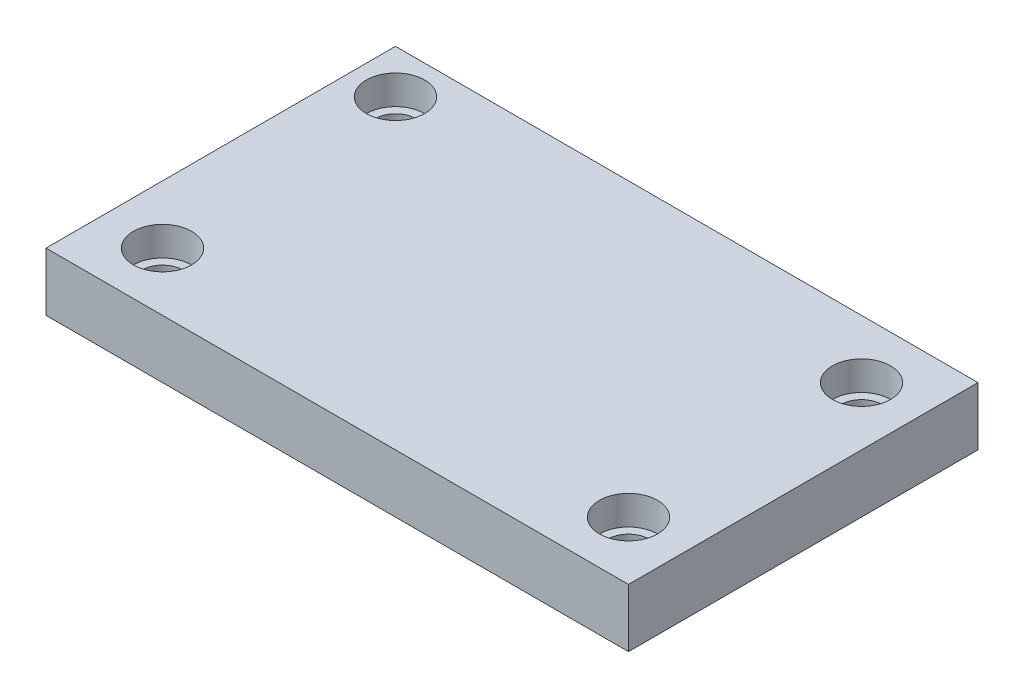
ISO-10303-21;
HEADER;
FILE_DESCRIPTION(('STEP AP214'),'2;1');
FILE_NAME('part.step','',(''),(''),'','','');
FILE_SCHEMA(('AUTOMOTIVE_DESIGN { 1 0 10303 214 1 1 1 1 }'));
ENDSEC;
DATA;
#1=APPLICATION_CONTEXT('core data for automotive mechanical design processes');
#2=APPLICATION_PROTOCOL_DEFINITION('international standard','automotive_design',2000,#1);
#3=PRODUCT_CONTEXT('',#1,'mechanical');
#4=PRODUCT('Part','Part','',(#3));
#5=PRODUCT_RELATED_PRODUCT_CATEGORY('part','',(#4));
#6=PRODUCT_DEFINITION_FORMATION('','',#4);
#7=PRODUCT_DEFINITION_CONTEXT('part definition',#1,'design');
#8=PRODUCT_DEFINITION('design','',#6,#7);
#9=PRODUCT_DEFINITION_SHAPE('','',#8);
#10=(LENGTH_UNIT() NAMED_UNIT(*) SI_UNIT(.MILLI.,.METRE.));
#11=(NAMED_UNIT(*) PLANE_ANGLE_UNIT() SI_UNIT($,.RADIAN.));
#12=(NAMED_UNIT(*) SI_UNIT($,.STERADIAN.) SOLID_ANGLE_UNIT());
#13=UNCERTAINTY_MEASURE_WITH_UNIT(LENGTH_MEASURE(1.E-05),#10,'distance_accuracy_value','');
#14=(GEOMETRIC_REPRESENTATION_CONTEXT(3) GLOBAL_UNCERTAINTY_ASSIGNED_CONTEXT((#13)) GLOBAL_UNIT_ASSIGNED_CONTEXT((#10,
#11,#12)) REPRESENTATION_CONTEXT('',''));
#15=CARTESIAN_POINT('',(0.,0.,0.));
#16=DIRECTION('',(0.,0.,1.));
#17=DIRECTION('',(1.,0.,0.));
#18=AXIS2_PLACEMENT_3D('',#15,#16,#17);
#19=CARTESIAN_POINT('',(18.,2.,2.));
#20=DIRECTION('',(0.,-1.,0.));
#21=DIRECTION('',(0.,0.,-1.));
#22=AXIS2_PLACEMENT_3D('',#19,#20,#21);
#23=CYLINDRICAL_SURFACE('',#22,0.699999999999998);
#24=CARTESIAN_POINT('',(18.,0.,2.));
#25=DIRECTION('',(0.,1.,0.));
#26=DIRECTION('',(0.,0.,1.));
#27=AXIS2_PLACEMENT_3D('',#24,#25,#26);
#28=CIRCLE('',#27,0.699999999999998);
#29=CARTESIAN_POINT('',(18.,0.,2.7));
#30=VERTEX_POINT('',#29);
#31=EDGE_CURVE('E164',#30,#30,#28,.T.);
#32=ORIENTED_EDGE('',*,*,#31,.F.);
#33=EDGE_LOOP('',(#32));
#34=FACE_BOUND('',#33,.T.);
#35=CARTESIAN_POINT('',(18.,1.,2.));
#36=DIRECTION('',(0.,1.,0.));
#37=DIRECTION('',(0.,0.,1.));
#38=AXIS2_PLACEMENT_3D('',#35,#36,#37);
#39=CIRCLE('',#38,0.699999999999998);
#40=CARTESIAN_POINT('',(18.,1.,2.7));
#41=VERTEX_POINT('',#40);
#42=EDGE_CURVE('E99',#41,#41,#39,.T.);
#43=ORIENTED_EDGE('',*,*,#42,.T.);
#44=EDGE_LOOP('',(#43));
#45=FACE_BOUND('',#44,.T.);
#46=ADVANCED_FACE('F95',(#34,#45),#23,.F.);
#47=CARTESIAN_POINT('',(18.,2.,10.));
#48=DIRECTION('',(0.,-1.,0.));
#49=DIRECTION('',(0.,0.,-1.));
#50=AXIS2_PLACEMENT_3D('',#47,#48,#49);
#51=CYLINDRICAL_SURFACE('',#50,0.699999999999998);
#52=CARTESIAN_POINT('',(18.,0.,10.));
#53=DIRECTION('',(0.,1.,0.));
#54=DIRECTION('',(0.,0.,1.));
#55=AXIS2_PLACEMENT_3D('',#52,#53,#54);
#56=CIRCLE('',#55,0.699999999999998);
#57=CARTESIAN_POINT('',(18.,0.,10.7));
#58=VERTEX_POINT('',#57);
#59=EDGE_CURVE('E193',#58,#58,#56,.T.);
#60=ORIENTED_EDGE('',*,*,#59,.F.);
#61=EDGE_LOOP('',(#60));
#62=FACE_BOUND('',#61,.T.);
#63=CARTESIAN_POINT('',(18.,1.,10.));
#64=DIRECTION('',(0.,1.,0.));
#65=DIRECTION('',(0.,0.,1.));
#66=AXIS2_PLACEMENT_3D('',#63,#64,#65);
#67=CIRCLE('',#66,0.699999999999998);
#68=CARTESIAN_POINT('',(18.,1.,10.7));
#69=VERTEX_POINT('',#68);
#70=EDGE_CURVE('E179',#69,#69,#67,.T.);
#71=ORIENTED_EDGE('',*,*,#70,.T.);
#72=EDGE_LOOP('',(#71));
#73=FACE_BOUND('',#72,.T.);
#74=ADVANCED_FACE('F208',(#62,#73),#51,.F.);
#75=CARTESIAN_POINT('',(1.5,2.,1.5));
#76=DIRECTION('',(0.,-1.,0.));
#77=DIRECTION('',(0.,0.,-1.));
#78=AXIS2_PLACEMENT_3D('',#75,#76,#77);
#79=CYLINDRICAL_SURFACE('',#78,0.700000000000001);
#80=CARTESIAN_POINT('',(1.5,0.,1.5));
#81=DIRECTION('',(0.,1.,0.));
#82=DIRECTION('',(0.,0.,1.));
#83=AXIS2_PLACEMENT_3D('',#80,#81,#82);
#84=CIRCLE('',#83,0.700000000000001);
#85=CARTESIAN_POINT('',(1.5,0.,2.2));
#86=VERTEX_POINT('',#85);
#87=EDGE_CURVE('E188',#86,#86,#84,.T.);
#88=ORIENTED_EDGE('',*,*,#87,.F.);
#89=EDGE_LOOP('',(#88));
#90=FACE_BOUND('',#89,.T.);
#91=CARTESIAN_POINT('',(1.5,1.,1.5));
#92=DIRECTION('',(0.,1.,0.));
#93=DIRECTION('',(0.,0.,1.));
#94=AXIS2_PLACEMENT_3D('',#91,#92,#93);
#95=CIRCLE('',#94,0.700000000000001);
#96=CARTESIAN_POINT('',(1.5,1.,2.2));
#97=VERTEX_POINT('',#96);
#98=EDGE_CURVE('E176',#97,#97,#95,.T.);
#99=ORIENTED_EDGE('',*,*,#98,.T.);
#100=EDGE_LOOP('',(#99));
#101=FACE_BOUND('',#100,.T.);
#102=ADVANCED_FACE('F213',(#90,#101),#79,.F.);
#103=CARTESIAN_POINT('',(2.,2.,10.));
#104=DIRECTION('',(0.,-1.,0.));
#105=DIRECTION('',(0.,0.,-1.));
#106=AXIS2_PLACEMENT_3D('',#103,#104,#105);
#107=CYLINDRICAL_SURFACE('',#106,0.7);
#108=CARTESIAN_POINT('',(2.,0.,10.));
#109=DIRECTION('',(0.,1.,0.));
#110=DIRECTION('',(0.,0.,1.));
#111=AXIS2_PLACEMENT_3D('',#108,#109,#110);
#112=CIRCLE('',#111,0.7);
#113=CARTESIAN_POINT('',(2.,0.,10.7));
#114=VERTEX_POINT('',#113);
#115=EDGE_CURVE('E184',#114,#114,#112,.T.);
#116=ORIENTED_EDGE('',*,*,#115,.F.);
#117=EDGE_LOOP('',(#116));
#118=FACE_BOUND('',#117,.T.);
#119=CARTESIAN_POINT('',(2.,1.,10.));
#120=DIRECTION('',(0.,1.,0.));
#121=DIRECTION('',(0.,0.,1.));
#122=AXIS2_PLACEMENT_3D('',#119,#120,#121);
#123=CIRCLE('',#122,0.7);
#124=CARTESIAN_POINT('',(2.,1.,10.7));
#125=VERTEX_POINT('',#124);
#126=EDGE_CURVE('E173',#125,#125,#123,.T.);
#127=ORIENTED_EDGE('',*,*,#126,.T.);
#128=EDGE_LOOP('',(#127));
#129=FACE_BOUND('',#128,.T.);
#130=ADVANCED_FACE('F220',(#118,#129),#107,.F.);
#131=CARTESIAN_POINT('',(0.,2.,0.));
#132=DIRECTION('',(0.,1.,0.));
#133=DIRECTION('',(0.,0.,1.));
#134=AXIS2_PLACEMENT_3D('',#131,#132,#133);
#135=PLANE('',#134);
#136=CARTESIAN_POINT('',(18.,2.,10.));
#137=DIRECTION('',(0.,1.,0.));
#138=DIRECTION('',(0.,0.,1.));
#139=AXIS2_PLACEMENT_3D('',#136,#137,#138);
#140=CIRCLE('',#139,1.);
#141=CARTESIAN_POINT('',(18.,2.,11.));
#142=VERTEX_POINT('',#141);
#143=EDGE_CURVE('E375',#142,#142,#140,.T.);
#144=ORIENTED_EDGE('',*,*,#143,.F.);
#145=EDGE_LOOP('',(#144));
#146=FACE_BOUND('',#145,.T.);
#147=CARTESIAN_POINT('',(18.,2.,2.));
#148=DIRECTION('',(0.,1.,0.));
#149=DIRECTION('',(0.,0.,1.));
#150=AXIS2_PLACEMENT_3D('',#147,#148,#149);
#151=CIRCLE('',#150,1.);
#152=CARTESIAN_POINT('',(18.,2.,3.));
#153=VERTEX_POINT('',#152);
#154=EDGE_CURVE('E374',#153,#153,#151,.T.);
#155=ORIENTED_EDGE('',*,*,#154,.F.);
#156=EDGE_LOOP('',(#155));
#157=FACE_BOUND('',#156,.T.);
#158=CARTESIAN_POINT('',(1.5,2.,1.5));
#159=DIRECTION('',(0.,1.,0.));
#160=DIRECTION('',(0.,0.,1.));
#161=AXIS2_PLACEMENT_3D('',#158,#159,#160);
#162=CIRCLE('',#161,1.);
#163=CARTESIAN_POINT('',(1.5,2.,2.5));
#164=VERTEX_POINT('',#163);
#165=EDGE_CURVE('E390',#164,#164,#162,.T.);
#166=ORIENTED_EDGE('',*,*,#165,.F.);
#167=EDGE_LOOP('',(#166));
#168=FACE_BOUND('',#167,.T.);
#169=CARTESIAN_POINT('',(2.,2.,10.));
#170=DIRECTION('',(0.,1.,0.));
#171=DIRECTION('',(0.,0.,1.));
#172=AXIS2_PLACEMENT_3D('',#169,#170,#171);
#173=CIRCLE('',#172,1.);
#174=CARTESIAN_POINT('',(2.,2.,11.));
#175=VERTEX_POINT('',#174);
#176=EDGE_CURVE('E196',#175,#175,#173,.T.);
#177=ORIENTED_EDGE('',*,*,#176,.F.);
#178=EDGE_LOOP('',(#177));
#179=FACE_BOUND('',#178,.T.);
#180=DIRECTION('',(0.,0.,1.));
#181=VECTOR('',#180,1.);
#182=CARTESIAN_POINT('',(0.,2.,0.));
#183=LINE('',#182,#181);
#184=CARTESIAN_POINT('',(0.,2.,0.));
#185=VERTEX_POINT('',#184);
#186=CARTESIAN_POINT('',(0.,2.,12.));
#187=VERTEX_POINT('',#186);
#188=EDGE_CURVE('E147',#185,#187,#183,.T.);
#189=ORIENTED_EDGE('',*,*,#188,.T.);
#190=DIRECTION('',(1.,0.,0.));
#191=VECTOR('',#190,1.);
#192=CARTESIAN_POINT('',(0.,2.,12.));
#193=LINE('',#192,#191);
#194=CARTESIAN_POINT('',(20.,2.,12.));
#195=VERTEX_POINT('',#194);
#196=EDGE_CURVE('E139',#187,#195,#193,.T.);
#197=ORIENTED_EDGE('',*,*,#196,.T.);
#198=DIRECTION('',(0.,0.,1.));
#199=VECTOR('',#198,1.);
#200=CARTESIAN_POINT('',(20.,2.,0.));
#201=LINE('',#200,#199);
#202=CARTESIAN_POINT('',(20.,2.,0.));
#203=VERTEX_POINT('',#202);
#204=EDGE_CURVE('E146',#203,#195,#201,.T.);
#205=ORIENTED_EDGE('',*,*,#204,.F.);
#206=DIRECTION('',(1.,0.,0.));
#207=VECTOR('',#206,1.);
#208=CARTESIAN_POINT('',(0.,2.,0.));
#209=LINE('',#208,#207);
#210=EDGE_CURVE('E157',#185,#203,#209,.T.);
#211=ORIENTED_EDGE('',*,*,#210,.F.);
#212=EDGE_LOOP('',(#189,#197,#205,#211));
#213=FACE_BOUND('',#212,.T.);
#214=ADVANCED_FACE('F143',(#146,#157,#168,#179,#213),#135,.T.);
#215=CARTESIAN_POINT('',(0.,0.,0.));
#216=DIRECTION('',(0.,1.,0.));
#217=DIRECTION('',(0.,0.,1.));
#218=AXIS2_PLACEMENT_3D('',#215,#216,#217);
#219=PLANE('',#218);
#220=DIRECTION('',(0.,0.,1.));
#221=VECTOR('',#220,1.);
#222=CARTESIAN_POINT('',(0.,0.,0.));
#223=LINE('',#222,#221);
#224=CARTESIAN_POINT('',(0.,0.,0.));
#225=VERTEX_POINT('',#224);
#226=CARTESIAN_POINT('',(0.,0.,12.));
#227=VERTEX_POINT('',#226);
#228=EDGE_CURVE('E162',#225,#227,#223,.T.);
#229=ORIENTED_EDGE('',*,*,#228,.F.);
#230=DIRECTION('',(1.,0.,0.));
#231=VECTOR('',#230,1.);
#232=CARTESIAN_POINT('',(0.,0.,0.));
#233=LINE('',#232,#231);
#234=CARTESIAN_POINT('',(20.,0.,0.));
#235=VERTEX_POINT('',#234);
#236=EDGE_CURVE('E168',#225,#235,#233,.T.);
#237=ORIENTED_EDGE('',*,*,#236,.T.);
#238=DIRECTION('',(0.,0.,1.));
#239=VECTOR('',#238,1.);
#240=CARTESIAN_POINT('',(20.,0.,0.));
#241=LINE('',#240,#239);
#242=CARTESIAN_POINT('',(20.,0.,12.));
#243=VERTEX_POINT('',#242);
#244=EDGE_CURVE('E166',#235,#243,#241,.T.);
#245=ORIENTED_EDGE('',*,*,#244,.T.);
#246=DIRECTION('',(1.,0.,0.));
#247=VECTOR('',#246,1.);
#248=CARTESIAN_POINT('',(0.,0.,12.));
#249=LINE('',#248,#247);
#250=EDGE_CURVE('E152',#227,#243,#249,.T.);
#251=ORIENTED_EDGE('',*,*,#250,.F.);
#252=EDGE_LOOP('',(#229,#237,#245,#251));
#253=FACE_BOUND('',#252,.T.);
#254=ORIENTED_EDGE('',*,*,#31,.T.);
#255=EDGE_LOOP('',(#254));
#256=FACE_BOUND('',#255,.T.);
#257=ORIENTED_EDGE('',*,*,#59,.T.);
#258=EDGE_LOOP('',(#257));
#259=FACE_BOUND('',#258,.T.);
#260=ORIENTED_EDGE('',*,*,#87,.T.);
#261=EDGE_LOOP('',(#260));
#262=FACE_BOUND('',#261,.T.);
#263=ORIENTED_EDGE('',*,*,#115,.T.);
#264=EDGE_LOOP('',(#263));
#265=FACE_BOUND('',#264,.T.);
#266=ADVANCED_FACE('F204',(#253,#256,#259,#262,#265),#219,.F.);
#267=CARTESIAN_POINT('',(0.,2.,0.));
#268=DIRECTION('',(1.,0.,0.));
#269=DIRECTION('',(0.,0.,-1.));
#270=AXIS2_PLACEMENT_3D('',#267,#268,#269);
#271=PLANE('',#270);
#272=ORIENTED_EDGE('',*,*,#228,.T.);
#273=DIRECTION('',(0.,-1.,0.));
#274=VECTOR('',#273,1.);
#275=CARTESIAN_POINT('',(0.,2.,12.));
#276=LINE('',#275,#274);
#277=EDGE_CURVE('E12',#187,#227,#276,.T.);
#278=ORIENTED_EDGE('',*,*,#277,.F.);
#279=ORIENTED_EDGE('',*,*,#188,.F.);
#280=DIRECTION('',(0.,-1.,0.));
#281=VECTOR('',#280,1.);
#282=CARTESIAN_POINT('',(0.,2.,0.));
#283=LINE('',#282,#281);
#284=EDGE_CURVE('E114',#185,#225,#283,.T.);
#285=ORIENTED_EDGE('',*,*,#284,.T.);
#286=EDGE_LOOP('',(#272,#278,#279,#285));
#287=FACE_BOUND('',#286,.T.);
#288=ADVANCED_FACE('F97',(#287),#271,.F.);
#289=CARTESIAN_POINT('',(0.,2.,12.));
#290=DIRECTION('',(0.,0.,-1.));
#291=DIRECTION('',(-1.,0.,0.));
#292=AXIS2_PLACEMENT_3D('',#289,#290,#291);
#293=PLANE('',#292);
#294=ORIENTED_EDGE('',*,*,#250,.T.);
#295=DIRECTION('',(0.,-1.,0.));
#296=VECTOR('',#295,1.);
#297=CARTESIAN_POINT('',(20.,2.,12.));
#298=LINE('',#297,#296);
#299=EDGE_CURVE('E105',#195,#243,#298,.T.);
#300=ORIENTED_EDGE('',*,*,#299,.F.);
#301=ORIENTED_EDGE('',*,*,#196,.F.);
#302=ORIENTED_EDGE('',*,*,#277,.T.);
#303=EDGE_LOOP('',(#294,#300,#301,#302));
#304=FACE_BOUND('',#303,.T.);
#305=ADVANCED_FACE('F151',(#304),#293,.F.);
#306=CARTESIAN_POINT('',(20.,2.,0.));
#307=DIRECTION('',(1.,0.,0.));
#308=DIRECTION('',(0.,0.,-1.));
#309=AXIS2_PLACEMENT_3D('',#306,#307,#308);
#310=PLANE('',#309);
#311=ORIENTED_EDGE('',*,*,#244,.F.);
#312=DIRECTION('',(0.,-1.,0.));
#313=VECTOR('',#312,1.);
#314=CARTESIAN_POINT('',(20.,2.,0.));
#315=LINE('',#314,#313);
#316=EDGE_CURVE('E128',#203,#235,#315,.T.);
#317=ORIENTED_EDGE('',*,*,#316,.F.);
#318=ORIENTED_EDGE('',*,*,#204,.T.);
#319=ORIENTED_EDGE('',*,*,#299,.T.);
#320=EDGE_LOOP('',(#311,#317,#318,#319));
#321=FACE_BOUND('',#320,.T.);
#322=ADVANCED_FACE('F156',(#321),#310,.T.);
#323=CARTESIAN_POINT('',(0.,2.,0.));
#324=DIRECTION('',(0.,0.,-1.));
#325=DIRECTION('',(-1.,0.,0.));
#326=AXIS2_PLACEMENT_3D('',#323,#324,#325);
#327=PLANE('',#326);
#328=ORIENTED_EDGE('',*,*,#236,.F.);
#329=ORIENTED_EDGE('',*,*,#284,.F.);
#330=ORIENTED_EDGE('',*,*,#210,.T.);
#331=ORIENTED_EDGE('',*,*,#316,.T.);
#332=EDGE_LOOP('',(#328,#329,#330,#331));
#333=FACE_BOUND('',#332,.T.);
#334=ADVANCED_FACE('F225',(#333),#327,.T.);
#335=CARTESIAN_POINT('',(2.,1.,10.));
#336=DIRECTION('',(0.,1.,0.));
#337=DIRECTION('',(0.,0.,1.));
#338=AXIS2_PLACEMENT_3D('',#335,#336,#337);
#339=CYLINDRICAL_SURFACE('',#338,1.);
#340=CARTESIAN_POINT('',(2.,1.,10.));
#341=DIRECTION('',(0.,1.,0.));
#342=DIRECTION('',(0.,0.,1.));
#343=AXIS2_PLACEMENT_3D('',#340,#341,#342);
#344=CIRCLE('',#343,1.);
#345=CARTESIAN_POINT('',(2.,1.,11.));
#346=VERTEX_POINT('',#345);
#347=EDGE_CURVE('E177',#346,#346,#344,.T.);
#348=ORIENTED_EDGE('',*,*,#347,.F.);
#349=EDGE_LOOP('',(#348));
#350=FACE_BOUND('',#349,.T.);
#351=ORIENTED_EDGE('',*,*,#176,.T.);
#352=EDGE_LOOP('',(#351));
#353=FACE_BOUND('',#352,.T.);
#354=ADVANCED_FACE('F228',(#350,#353),#339,.F.);
#355=CARTESIAN_POINT('',(2.,1.,10.));
#356=DIRECTION('',(0.,1.,0.));
#357=DIRECTION('',(0.,0.,1.));
#358=AXIS2_PLACEMENT_3D('',#355,#356,#357);
#359=PLANE('',#358);
#360=ORIENTED_EDGE('',*,*,#126,.F.);
#361=EDGE_LOOP('',(#360));
#362=FACE_BOUND('',#361,.T.);
#363=ORIENTED_EDGE('',*,*,#347,.T.);
#364=EDGE_LOOP('',(#363));
#365=FACE_BOUND('',#364,.T.);
#366=ADVANCED_FACE('F296',(#362,#365),#359,.T.);
#367=CARTESIAN_POINT('',(1.5,1.,1.5));
#368=DIRECTION('',(0.,1.,0.));
#369=DIRECTION('',(0.,0.,1.));
#370=AXIS2_PLACEMENT_3D('',#367,#368,#369);
#371=CYLINDRICAL_SURFACE('',#370,1.);
#372=CARTESIAN_POINT('',(1.5,1.,1.5));
#373=DIRECTION('',(0.,1.,0.));
#374=DIRECTION('',(0.,0.,1.));
#375=AXIS2_PLACEMENT_3D('',#372,#373,#374);
#376=CIRCLE('',#375,1.);
#377=CARTESIAN_POINT('',(1.5,1.,2.5));
#378=VERTEX_POINT('',#377);
#379=EDGE_CURVE('E378',#378,#378,#376,.T.);
#380=ORIENTED_EDGE('',*,*,#379,.F.);
#381=EDGE_LOOP('',(#380));
#382=FACE_BOUND('',#381,.T.);
#383=ORIENTED_EDGE('',*,*,#165,.T.);
#384=EDGE_LOOP('',(#383));
#385=FACE_BOUND('',#384,.T.);
#386=ADVANCED_FACE('F303',(#382,#385),#371,.F.);
#387=CARTESIAN_POINT('',(1.5,1.,1.5));
#388=DIRECTION('',(0.,1.,0.));
#389=DIRECTION('',(0.,0.,1.));
#390=AXIS2_PLACEMENT_3D('',#387,#388,#389);
#391=PLANE('',#390);
#392=ORIENTED_EDGE('',*,*,#98,.F.);
#393=EDGE_LOOP('',(#392));
#394=FACE_BOUND('',#393,.T.);
#395=ORIENTED_EDGE('',*,*,#379,.T.);
#396=EDGE_LOOP('',(#395));
#397=FACE_BOUND('',#396,.T.);
#398=ADVANCED_FACE('F311',(#394,#397),#391,.T.);
#399=CARTESIAN_POINT('',(18.,1.,10.));
#400=DIRECTION('',(0.,1.,0.));
#401=DIRECTION('',(0.,0.,1.));
#402=AXIS2_PLACEMENT_3D('',#399,#400,#401);
#403=CYLINDRICAL_SURFACE('',#402,1.);
#404=CARTESIAN_POINT('',(18.,1.,10.));
#405=DIRECTION('',(0.,1.,0.));
#406=DIRECTION('',(0.,0.,1.));
#407=AXIS2_PLACEMENT_3D('',#404,#405,#406);
#408=CIRCLE('',#407,1.);
#409=CARTESIAN_POINT('',(18.,1.,11.));
#410=VERTEX_POINT('',#409);
#411=EDGE_CURVE('E381',#410,#410,#408,.T.);
#412=ORIENTED_EDGE('',*,*,#411,.F.);
#413=EDGE_LOOP('',(#412));
#414=FACE_BOUND('',#413,.T.);
#415=ORIENTED_EDGE('',*,*,#143,.T.);
#416=EDGE_LOOP('',(#415));
#417=FACE_BOUND('',#416,.T.);
#418=ADVANCED_FACE('F319',(#414,#417),#403,.F.);
#419=CARTESIAN_POINT('',(18.,1.,10.));
#420=DIRECTION('',(0.,1.,0.));
#421=DIRECTION('',(0.,0.,1.));
#422=AXIS2_PLACEMENT_3D('',#419,#420,#421);
#423=PLANE('',#422);
#424=ORIENTED_EDGE('',*,*,#70,.F.);
#425=EDGE_LOOP('',(#424));
#426=FACE_BOUND('',#425,.T.);
#427=ORIENTED_EDGE('',*,*,#411,.T.);
#428=EDGE_LOOP('',(#427));
#429=FACE_BOUND('',#428,.T.);
#430=ADVANCED_FACE('F327',(#426,#429),#423,.T.);
#431=CARTESIAN_POINT('',(18.,1.,2.));
#432=DIRECTION('',(0.,1.,0.));
#433=DIRECTION('',(0.,0.,1.));
#434=AXIS2_PLACEMENT_3D('',#431,#432,#433);
#435=CYLINDRICAL_SURFACE('',#434,1.);
#436=CARTESIAN_POINT('',(18.,1.,2.));
#437=DIRECTION('',(0.,1.,0.));
#438=DIRECTION('',(0.,0.,1.));
#439=AXIS2_PLACEMENT_3D('',#436,#437,#438);
#440=CIRCLE('',#439,1.);
#441=CARTESIAN_POINT('',(18.,1.,3.));
#442=VERTEX_POINT('',#441);
#443=EDGE_CURVE('E373',#442,#442,#440,.T.);
#444=ORIENTED_EDGE('',*,*,#443,.F.);
#445=EDGE_LOOP('',(#444));
#446=FACE_BOUND('',#445,.T.);
#447=ORIENTED_EDGE('',*,*,#154,.T.);
#448=EDGE_LOOP('',(#447));
#449=FACE_BOUND('',#448,.T.);
#450=ADVANCED_FACE('F335',(#446,#449),#435,.F.);
#451=CARTESIAN_POINT('',(18.,1.,2.));
#452=DIRECTION('',(0.,1.,0.));
#453=DIRECTION('',(0.,0.,1.));
#454=AXIS2_PLACEMENT_3D('',#451,#452,#453);
#455=PLANE('',#454);
#456=ORIENTED_EDGE('',*,*,#42,.F.);
#457=EDGE_LOOP('',(#456));
#458=FACE_BOUND('',#457,.T.);
#459=ORIENTED_EDGE('',*,*,#443,.T.);
#460=EDGE_LOOP('',(#459));
#461=FACE_BOUND('',#460,.T.);
#462=ADVANCED_FACE('F343',(#458,#461),#455,.T.);
#463=CLOSED_SHELL('',(#46,#74,#102,#130,#214,#266,#288,#305,#322,#334,#354,#366,#386,#398,#418,
#430,#450,#462));
#464=MANIFOLD_SOLID_BREP('B2',#463);
#465=ADVANCED_BREP_SHAPE_REPRESENTATION('',(#18,#464),#14);
#466=SHAPE_DEFINITION_REPRESENTATION(#9,#465);
ENDSEC;
END-ISO-10303-21;
